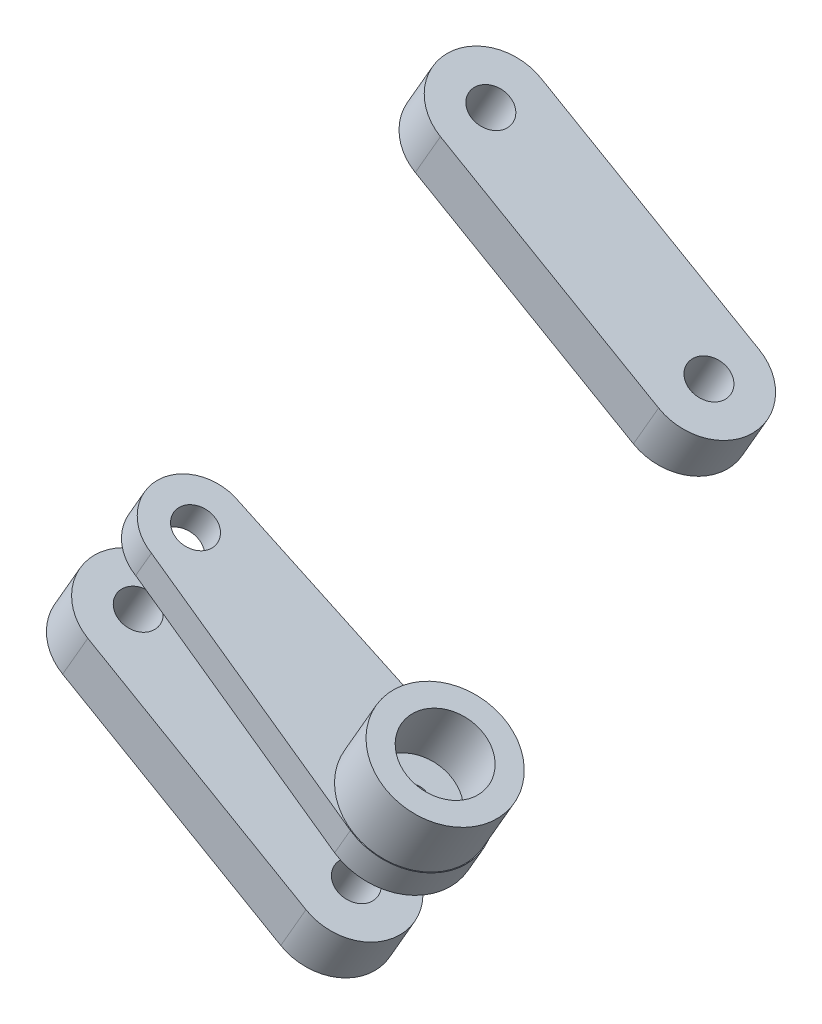
ISO-10303-21;
HEADER;
FILE_DESCRIPTION(('STEP AP214'),'2;1');
FILE_NAME('part.step','',(''),(''),'','','');
FILE_SCHEMA(('AUTOMOTIVE_DESIGN { 1 0 10303 214 1 1 1 1 }'));
ENDSEC;
DATA;
#1=APPLICATION_CONTEXT('core data for automotive mechanical design processes');
#2=APPLICATION_PROTOCOL_DEFINITION('international standard','automotive_design',2000,#1);
#3=PRODUCT_CONTEXT('',#1,'mechanical');
#4=PRODUCT('Part','Part','',(#3));
#5=PRODUCT_RELATED_PRODUCT_CATEGORY('part','',(#4));
#6=PRODUCT_DEFINITION_FORMATION('','',#4);
#7=PRODUCT_DEFINITION_CONTEXT('part definition',#1,'design');
#8=PRODUCT_DEFINITION('design','',#6,#7);
#9=PRODUCT_DEFINITION_SHAPE('','',#8);
#10=(LENGTH_UNIT() NAMED_UNIT(*) SI_UNIT(.MILLI.,.METRE.));
#11=(NAMED_UNIT(*) PLANE_ANGLE_UNIT() SI_UNIT($,.RADIAN.));
#12=(NAMED_UNIT(*) SI_UNIT($,.STERADIAN.) SOLID_ANGLE_UNIT());
#13=UNCERTAINTY_MEASURE_WITH_UNIT(LENGTH_MEASURE(1.E-05),#10,'distance_accuracy_value','');
#14=(GEOMETRIC_REPRESENTATION_CONTEXT(3) GLOBAL_UNCERTAINTY_ASSIGNED_CONTEXT((#13)) GLOBAL_UNIT_ASSIGNED_CONTEXT((#10,
#11,#12)) REPRESENTATION_CONTEXT('',''));
#15=CARTESIAN_POINT('',(0.,0.,0.));
#16=DIRECTION('',(0.,0.,1.));
#17=DIRECTION('',(1.,0.,0.));
#18=AXIS2_PLACEMENT_3D('',#15,#16,#17);
#19=CARTESIAN_POINT('',(638.208275066706,936.295987182416,1324.75360446065));
#20=DIRECTION('',(-0.499999999999999,-0.866025403784439,0.));
#21=DIRECTION('',(-2.54504750607509E-13,1.4642453916025E-13,1.));
#22=AXIS2_PLACEMENT_3D('',#19,#20,#21);
#23=PLANE('',#22);
#24=CARTESIAN_POINT('',(638.208275066706,936.295987182416,1324.75360446065));
#25=DIRECTION('',(-0.499999999999999,-0.866025403784439,0.));
#26=DIRECTION('',(-2.54504750607509E-13,1.4642453916025E-13,1.));
#27=AXIS2_PLACEMENT_3D('',#24,#25,#26);
#28=CIRCLE('',#27,1.5);
#29=CARTESIAN_POINT('',(638.208275066705,936.295987182417,1326.25360446065));
#30=VERTEX_POINT('',#29);
#31=EDGE_CURVE('P0_E84',#30,#30,#28,.T.);
#32=ORIENTED_EDGE('',*,*,#31,.F.);
#33=EDGE_LOOP('',(#32));
#34=FACE_BOUND('',#33,.T.);
#35=CARTESIAN_POINT('',(638.208275066706,936.295987182416,1324.75360446065));
#36=DIRECTION('',(-0.499999999999999,-0.866025403784439,0.));
#37=DIRECTION('',(-2.54504750607509E-13,1.4642453916025E-13,1.));
#38=AXIS2_PLACEMENT_3D('',#35,#36,#37);
#39=CIRCLE('',#38,4.);
#40=CARTESIAN_POINT('',(638.208275066705,936.295987182417,1328.75360446065));
#41=VERTEX_POINT('',#40);
#42=CARTESIAN_POINT('',(638.208275066707,936.295987182416,1320.75360446065));
#43=VERTEX_POINT('',#42);
#44=EDGE_CURVE('P0_E69',#41,#43,#39,.T.);
#45=ORIENTED_EDGE('',*,*,#44,.T.);
#46=DIRECTION('',(0.866025403784439,-0.499999999999999,2.93619848990051E-13));
#47=VECTOR('',#46,1.);
#48=CARTESIAN_POINT('',(638.208275066707,936.295987182416,1320.75360446065));
#49=LINE('',#48,#47);
#50=CARTESIAN_POINT('',(655.528783142396,926.295987182416,1320.75360446066));
#51=VERTEX_POINT('',#50);
#52=EDGE_CURVE('P0_E64',#43,#51,#49,.T.);
#53=ORIENTED_EDGE('',*,*,#52,.T.);
#54=CARTESIAN_POINT('',(655.528783142395,926.295987182416,1324.75360446066));
#55=DIRECTION('',(-0.499999999999999,-0.866025403784439,0.));
#56=DIRECTION('',(-2.54504750607509E-13,1.4642453916025E-13,1.));
#57=AXIS2_PLACEMENT_3D('',#54,#55,#56);
#58=CIRCLE('',#57,4.);
#59=CARTESIAN_POINT('',(655.528783142394,926.295987182417,1328.75360446066));
#60=VERTEX_POINT('',#59);
#61=EDGE_CURVE('P0_E67',#51,#60,#58,.T.);
#62=ORIENTED_EDGE('',*,*,#61,.T.);
#63=DIRECTION('',(-0.866025403784439,0.499999999999999,-2.93619848990051E-13));
#64=VECTOR('',#63,1.);
#65=CARTESIAN_POINT('',(638.208275066705,936.295987182417,1328.75360446065));
#66=LINE('',#65,#64);
#67=EDGE_CURVE('P0_E34',#60,#41,#66,.T.);
#68=ORIENTED_EDGE('',*,*,#67,.T.);
#69=EDGE_LOOP('',(#45,#53,#62,#68));
#70=FACE_BOUND('',#69,.T.);
#71=CARTESIAN_POINT('',(655.528783142395,926.295987182416,1324.75360446066));
#72=DIRECTION('',(-0.499999999999999,-0.866025403784439,0.));
#73=DIRECTION('',(-2.54504750607509E-13,1.4642453916025E-13,1.));
#74=AXIS2_PLACEMENT_3D('',#71,#72,#73);
#75=CIRCLE('',#74,1.5);
#76=CARTESIAN_POINT('',(655.528783142394,926.295987182417,1326.25360446066));
#77=VERTEX_POINT('',#76);
#78=EDGE_CURVE('P0_E99',#77,#77,#75,.T.);
#79=ORIENTED_EDGE('',*,*,#78,.F.);
#80=EDGE_LOOP('',(#79));
#81=FACE_BOUND('',#80,.T.);
#82=ADVANCED_FACE('P0_F17',(#34,#70,#81),#23,.T.);
#83=CARTESIAN_POINT('',(640.208275066706,939.760088797554,1324.75360446065));
#84=DIRECTION('',(-0.499999999999999,-0.866025403784439,0.));
#85=DIRECTION('',(-2.54504750607509E-13,1.4642453916025E-13,1.));
#86=AXIS2_PLACEMENT_3D('',#83,#84,#85);
#87=PLANE('',#86);
#88=CARTESIAN_POINT('',(640.208275066706,939.760088797554,1324.75360446065));
#89=DIRECTION('',(-0.499999999999999,-0.866025403784439,0.));
#90=DIRECTION('',(-2.54504750607509E-13,1.4642453916025E-13,1.));
#91=AXIS2_PLACEMENT_3D('',#88,#89,#90);
#92=CIRCLE('',#91,4.);
#93=CARTESIAN_POINT('',(640.208275066705,939.760088797555,1328.75360446065));
#94=VERTEX_POINT('',#93);
#95=CARTESIAN_POINT('',(640.208275066707,939.760088797554,1320.75360446065));
#96=VERTEX_POINT('',#95);
#97=EDGE_CURVE('P0_E81',#94,#96,#92,.T.);
#98=ORIENTED_EDGE('',*,*,#97,.F.);
#99=DIRECTION('',(-0.866025403784439,0.499999999999999,-2.93619848990051E-13));
#100=VECTOR('',#99,1.);
#101=CARTESIAN_POINT('',(640.208275066705,939.760088797555,1328.75360446065));
#102=LINE('',#101,#100);
#103=CARTESIAN_POINT('',(657.528783142394,929.760088797555,1328.75360446066));
#104=VERTEX_POINT('',#103);
#105=EDGE_CURVE('P0_E57',#104,#94,#102,.T.);
#106=ORIENTED_EDGE('',*,*,#105,.F.);
#107=CARTESIAN_POINT('',(657.528783142395,929.760088797554,1324.75360446066));
#108=DIRECTION('',(-0.499999999999999,-0.866025403784439,0.));
#109=DIRECTION('',(-2.54504750607509E-13,1.4642453916025E-13,1.));
#110=AXIS2_PLACEMENT_3D('',#107,#108,#109);
#111=CIRCLE('',#110,4.);
#112=CARTESIAN_POINT('',(657.528783142396,929.760088797554,1320.75360446066));
#113=VERTEX_POINT('',#112);
#114=EDGE_CURVE('P0_E51',#113,#104,#111,.T.);
#115=ORIENTED_EDGE('',*,*,#114,.F.);
#116=DIRECTION('',(0.866025403784439,-0.499999999999999,2.93619848990051E-13));
#117=VECTOR('',#116,1.);
#118=CARTESIAN_POINT('',(640.208275066707,939.760088797554,1320.75360446065));
#119=LINE('',#118,#117);
#120=EDGE_CURVE('P0_E73',#96,#113,#119,.T.);
#121=ORIENTED_EDGE('',*,*,#120,.F.);
#122=EDGE_LOOP('',(#98,#106,#115,#121));
#123=FACE_BOUND('',#122,.T.);
#124=CARTESIAN_POINT('',(640.208275066706,939.760088797554,1324.75360446065));
#125=DIRECTION('',(-0.499999999999999,-0.866025403784439,0.));
#126=DIRECTION('',(-2.54504750607509E-13,1.4642453916025E-13,1.));
#127=AXIS2_PLACEMENT_3D('',#124,#125,#126);
#128=CIRCLE('',#127,1.5);
#129=CARTESIAN_POINT('',(640.208275066705,939.760088797554,1326.25360446065));
#130=VERTEX_POINT('',#129);
#131=EDGE_CURVE('P0_E96',#130,#130,#128,.T.);
#132=ORIENTED_EDGE('',*,*,#131,.T.);
#133=EDGE_LOOP('',(#132));
#134=FACE_BOUND('',#133,.T.);
#135=CARTESIAN_POINT('',(657.528783142395,929.760088797554,1324.75360446066));
#136=DIRECTION('',(-0.499999999999999,-0.866025403784439,0.));
#137=DIRECTION('',(-2.54504750607509E-13,1.4642453916025E-13,1.));
#138=AXIS2_PLACEMENT_3D('',#135,#136,#137);
#139=CIRCLE('',#138,1.5);
#140=CARTESIAN_POINT('',(657.528783142394,929.760088797554,1326.25360446066));
#141=VERTEX_POINT('',#140);
#142=EDGE_CURVE('P0_E102',#141,#141,#139,.T.);
#143=ORIENTED_EDGE('',*,*,#142,.T.);
#144=EDGE_LOOP('',(#143));
#145=FACE_BOUND('',#144,.T.);
#146=ADVANCED_FACE('P0_F92',(#123,#134,#145),#87,.F.);
#147=CARTESIAN_POINT('',(638.208275066706,936.295987182416,1324.75360446065));
#148=DIRECTION('',(0.499999999999999,0.866025403784439,0.));
#149=DIRECTION('',(2.54504750607509E-13,-1.4642453916025E-13,-1.));
#150=AXIS2_PLACEMENT_3D('',#147,#148,#149);
#151=CYLINDRICAL_SURFACE('',#150,4.);
#152=ORIENTED_EDGE('',*,*,#97,.T.);
#153=DIRECTION('',(0.499999999999999,0.866025403784439,0.));
#154=VECTOR('',#153,1.);
#155=CARTESIAN_POINT('',(638.208275066707,936.295987182416,1320.75360446065));
#156=LINE('',#155,#154);
#157=EDGE_CURVE('P0_E11',#43,#96,#156,.T.);
#158=ORIENTED_EDGE('',*,*,#157,.F.);
#159=ORIENTED_EDGE('',*,*,#44,.F.);
#160=DIRECTION('',(0.499999999999999,0.866025403784439,0.));
#161=VECTOR('',#160,1.);
#162=CARTESIAN_POINT('',(638.208275066705,936.295987182417,1328.75360446065));
#163=LINE('',#162,#161);
#164=EDGE_CURVE('P0_E77',#41,#94,#163,.T.);
#165=ORIENTED_EDGE('',*,*,#164,.T.);
#166=EDGE_LOOP('',(#152,#158,#159,#165));
#167=FACE_BOUND('',#166,.T.);
#168=ADVANCED_FACE('P0_F19',(#167),#151,.T.);
#169=CARTESIAN_POINT('',(638.208275066707,936.295987182416,1320.75360446065));
#170=DIRECTION('',(-2.54504750607509E-13,1.4642453916025E-13,1.));
#171=DIRECTION('',(0.499999999999999,0.866025403784439,0.));
#172=AXIS2_PLACEMENT_3D('',#169,#170,#171);
#173=PLANE('',#172);
#174=ORIENTED_EDGE('',*,*,#120,.T.);
#175=DIRECTION('',(0.499999999999999,0.866025403784439,0.));
#176=VECTOR('',#175,1.);
#177=CARTESIAN_POINT('',(655.528783142396,926.295987182416,1320.75360446066));
#178=LINE('',#177,#176);
#179=EDGE_CURVE('P0_E26',#51,#113,#178,.T.);
#180=ORIENTED_EDGE('',*,*,#179,.F.);
#181=ORIENTED_EDGE('',*,*,#52,.F.);
#182=ORIENTED_EDGE('',*,*,#157,.T.);
#183=EDGE_LOOP('',(#174,#180,#181,#182));
#184=FACE_BOUND('',#183,.T.);
#185=ADVANCED_FACE('P0_F72',(#184),#173,.F.);
#186=CARTESIAN_POINT('',(655.528783142395,926.295987182416,1324.75360446066));
#187=DIRECTION('',(0.499999999999999,0.866025403784439,0.));
#188=DIRECTION('',(2.54504750607509E-13,-1.4642453916025E-13,-1.));
#189=AXIS2_PLACEMENT_3D('',#186,#187,#188);
#190=CYLINDRICAL_SURFACE('',#189,4.);
#191=ORIENTED_EDGE('',*,*,#114,.T.);
#192=DIRECTION('',(0.499999999999999,0.866025403784439,0.));
#193=VECTOR('',#192,1.);
#194=CARTESIAN_POINT('',(655.528783142394,926.295987182417,1328.75360446066));
#195=LINE('',#194,#193);
#196=EDGE_CURVE('P0_E74',#60,#104,#195,.T.);
#197=ORIENTED_EDGE('',*,*,#196,.F.);
#198=ORIENTED_EDGE('',*,*,#61,.F.);
#199=ORIENTED_EDGE('',*,*,#179,.T.);
#200=EDGE_LOOP('',(#191,#197,#198,#199));
#201=FACE_BOUND('',#200,.T.);
#202=ADVANCED_FACE('P0_F75',(#201),#190,.T.);
#203=CARTESIAN_POINT('',(638.208275066705,936.295987182417,1328.75360446065));
#204=DIRECTION('',(2.54504750607509E-13,-1.4642453916025E-13,-1.));
#205=DIRECTION('',(-0.499999999999999,-0.866025403784439,0.));
#206=AXIS2_PLACEMENT_3D('',#203,#204,#205);
#207=PLANE('',#206);
#208=ORIENTED_EDGE('',*,*,#105,.T.);
#209=ORIENTED_EDGE('',*,*,#164,.F.);
#210=ORIENTED_EDGE('',*,*,#67,.F.);
#211=ORIENTED_EDGE('',*,*,#196,.T.);
#212=EDGE_LOOP('',(#208,#209,#210,#211));
#213=FACE_BOUND('',#212,.T.);
#214=ADVANCED_FACE('P0_F89',(#213),#207,.F.);
#215=CARTESIAN_POINT('',(638.208275066706,936.295987182416,1324.75360446065));
#216=DIRECTION('',(0.499999999999999,0.866025403784439,0.));
#217=DIRECTION('',(2.54504750607509E-13,-1.4642453916025E-13,-1.));
#218=AXIS2_PLACEMENT_3D('',#215,#216,#217);
#219=CYLINDRICAL_SURFACE('',#218,1.5);
#220=ORIENTED_EDGE('',*,*,#31,.T.);
#221=EDGE_LOOP('',(#220));
#222=FACE_BOUND('',#221,.T.);
#223=ORIENTED_EDGE('',*,*,#131,.F.);
#224=EDGE_LOOP('',(#223));
#225=FACE_BOUND('',#224,.T.);
#226=ADVANCED_FACE('P0_F120',(#222,#225),#219,.F.);
#227=CARTESIAN_POINT('',(655.528783142395,926.295987182416,1324.75360446066));
#228=DIRECTION('',(0.499999999999999,0.866025403784439,0.));
#229=DIRECTION('',(2.54504750607509E-13,-1.4642453916025E-13,-1.));
#230=AXIS2_PLACEMENT_3D('',#227,#228,#229);
#231=CYLINDRICAL_SURFACE('',#230,1.5);
#232=ORIENTED_EDGE('',*,*,#78,.T.);
#233=EDGE_LOOP('',(#232));
#234=FACE_BOUND('',#233,.T.);
#235=ORIENTED_EDGE('',*,*,#142,.F.);
#236=EDGE_LOOP('',(#235));
#237=FACE_BOUND('',#236,.T.);
#238=ADVANCED_FACE('P0_F108',(#234,#237),#231,.F.);
#239=CLOSED_SHELL('',(#82,#146,#168,#185,#202,#214,#226,#238));
#240=MANIFOLD_SOLID_BREP('P0_B1',#239);
#241=CARTESIAN_POINT('',(610.208275067009,887.798564570313,1324.75360446062));
#242=DIRECTION('',(-0.5,-0.866025403784438,0.));
#243=DIRECTION('',(0.,0.,1.));
#244=AXIS2_PLACEMENT_3D('',#241,#242,#243);
#245=PLANE('',#244);
#246=CARTESIAN_POINT('',(610.208275067009,887.798564570313,1324.75360446062));
#247=DIRECTION('',(-0.5,-0.866025403784438,0.));
#248=DIRECTION('',(0.,0.,1.));
#249=AXIS2_PLACEMENT_3D('',#246,#247,#248);
#250=CIRCLE('',#249,1.5);
#251=CARTESIAN_POINT('',(610.208275067009,887.798564570313,1323.25360446062));
#252=VERTEX_POINT('',#251);
#253=EDGE_CURVE('P1_E84',#252,#252,#250,.T.);
#254=ORIENTED_EDGE('',*,*,#253,.F.);
#255=EDGE_LOOP('',(#254));
#256=FACE_BOUND('',#255,.T.);
#257=CARTESIAN_POINT('',(610.208275067009,887.798564570313,1324.75360446062));
#258=DIRECTION('',(-0.5,-0.866025403784438,0.));
#259=DIRECTION('',(0.,0.,1.));
#260=AXIS2_PLACEMENT_3D('',#257,#258,#259);
#261=CIRCLE('',#260,4.);
#262=CARTESIAN_POINT('',(610.208275067009,887.798564570313,1328.75360446062));
#263=VERTEX_POINT('',#262);
#264=CARTESIAN_POINT('',(610.208275067009,887.798564570313,1320.75360446062));
#265=VERTEX_POINT('',#264);
#266=EDGE_CURVE('P1_E69',#263,#265,#261,.T.);
#267=ORIENTED_EDGE('',*,*,#266,.T.);
#268=DIRECTION('',(0.866025403784438,-0.500000000000001,0.));
#269=VECTOR('',#268,1.);
#270=CARTESIAN_POINT('',(610.208275067009,887.798564570313,1320.75360446062));
#271=LINE('',#270,#269);
#272=CARTESIAN_POINT('',(627.528783142698,877.798564570313,1320.75360446062));
#273=VERTEX_POINT('',#272);
#274=EDGE_CURVE('P1_E64',#265,#273,#271,.T.);
#275=ORIENTED_EDGE('',*,*,#274,.T.);
#276=CARTESIAN_POINT('',(627.528783142698,877.798564570313,1324.75360446062));
#277=DIRECTION('',(-0.5,-0.866025403784438,0.));
#278=DIRECTION('',(0.,0.,1.));
#279=AXIS2_PLACEMENT_3D('',#276,#277,#278);
#280=CIRCLE('',#279,4.);
#281=CARTESIAN_POINT('',(627.528783142698,877.798564570313,1328.75360446062));
#282=VERTEX_POINT('',#281);
#283=EDGE_CURVE('P1_E67',#273,#282,#280,.T.);
#284=ORIENTED_EDGE('',*,*,#283,.T.);
#285=DIRECTION('',(-0.866025403784438,0.500000000000001,0.));
#286=VECTOR('',#285,1.);
#287=CARTESIAN_POINT('',(610.208275067009,887.798564570313,1328.75360446062));
#288=LINE('',#287,#286);
#289=EDGE_CURVE('P1_E34',#282,#263,#288,.T.);
#290=ORIENTED_EDGE('',*,*,#289,.T.);
#291=EDGE_LOOP('',(#267,#275,#284,#290));
#292=FACE_BOUND('',#291,.T.);
#293=CARTESIAN_POINT('',(627.528783142698,877.798564570313,1324.75360446062));
#294=DIRECTION('',(-0.5,-0.866025403784438,0.));
#295=DIRECTION('',(0.,0.,1.));
#296=AXIS2_PLACEMENT_3D('',#293,#294,#295);
#297=CIRCLE('',#296,1.5);
#298=CARTESIAN_POINT('',(627.528783142698,877.798564570313,1323.25360446062));
#299=VERTEX_POINT('',#298);
#300=EDGE_CURVE('P1_E99',#299,#299,#297,.T.);
#301=ORIENTED_EDGE('',*,*,#300,.F.);
#302=EDGE_LOOP('',(#301));
#303=FACE_BOUND('',#302,.T.);
#304=ADVANCED_FACE('P1_F17',(#256,#292,#303),#245,.T.);
#305=CARTESIAN_POINT('',(612.208275067009,891.26266618545,1324.75360446062));
#306=DIRECTION('',(-0.5,-0.866025403784438,0.));
#307=DIRECTION('',(0.,0.,1.));
#308=AXIS2_PLACEMENT_3D('',#305,#306,#307);
#309=PLANE('',#308);
#310=CARTESIAN_POINT('',(612.208275067009,891.26266618545,1324.75360446062));
#311=DIRECTION('',(-0.5,-0.866025403784438,0.));
#312=DIRECTION('',(0.,0.,1.));
#313=AXIS2_PLACEMENT_3D('',#310,#311,#312);
#314=CIRCLE('',#313,4.);
#315=CARTESIAN_POINT('',(612.208275067009,891.26266618545,1328.75360446062));
#316=VERTEX_POINT('',#315);
#317=CARTESIAN_POINT('',(612.208275067009,891.26266618545,1320.75360446062));
#318=VERTEX_POINT('',#317);
#319=EDGE_CURVE('P1_E81',#316,#318,#314,.T.);
#320=ORIENTED_EDGE('',*,*,#319,.F.);
#321=DIRECTION('',(-0.866025403784438,0.500000000000001,0.));
#322=VECTOR('',#321,1.);
#323=CARTESIAN_POINT('',(612.208275067009,891.26266618545,1328.75360446062));
#324=LINE('',#323,#322);
#325=CARTESIAN_POINT('',(629.528783142698,881.26266618545,1328.75360446062));
#326=VERTEX_POINT('',#325);
#327=EDGE_CURVE('P1_E57',#326,#316,#324,.T.);
#328=ORIENTED_EDGE('',*,*,#327,.F.);
#329=CARTESIAN_POINT('',(629.528783142698,881.26266618545,1324.75360446062));
#330=DIRECTION('',(-0.5,-0.866025403784438,0.));
#331=DIRECTION('',(0.,0.,1.));
#332=AXIS2_PLACEMENT_3D('',#329,#330,#331);
#333=CIRCLE('',#332,4.);
#334=CARTESIAN_POINT('',(629.528783142698,881.26266618545,1320.75360446062));
#335=VERTEX_POINT('',#334);
#336=EDGE_CURVE('P1_E51',#335,#326,#333,.T.);
#337=ORIENTED_EDGE('',*,*,#336,.F.);
#338=DIRECTION('',(0.866025403784438,-0.500000000000001,0.));
#339=VECTOR('',#338,1.);
#340=CARTESIAN_POINT('',(612.208275067009,891.26266618545,1320.75360446062));
#341=LINE('',#340,#339);
#342=EDGE_CURVE('P1_E73',#318,#335,#341,.T.);
#343=ORIENTED_EDGE('',*,*,#342,.F.);
#344=EDGE_LOOP('',(#320,#328,#337,#343));
#345=FACE_BOUND('',#344,.T.);
#346=CARTESIAN_POINT('',(612.208275067009,891.26266618545,1324.75360446062));
#347=DIRECTION('',(-0.5,-0.866025403784438,0.));
#348=DIRECTION('',(0.,0.,1.));
#349=AXIS2_PLACEMENT_3D('',#346,#347,#348);
#350=CIRCLE('',#349,1.5);
#351=CARTESIAN_POINT('',(612.208275067009,891.26266618545,1323.25360446062));
#352=VERTEX_POINT('',#351);
#353=EDGE_CURVE('P1_E96',#352,#352,#350,.T.);
#354=ORIENTED_EDGE('',*,*,#353,.T.);
#355=EDGE_LOOP('',(#354));
#356=FACE_BOUND('',#355,.T.);
#357=CARTESIAN_POINT('',(629.528783142698,881.26266618545,1324.75360446062));
#358=DIRECTION('',(-0.5,-0.866025403784438,0.));
#359=DIRECTION('',(0.,0.,1.));
#360=AXIS2_PLACEMENT_3D('',#357,#358,#359);
#361=CIRCLE('',#360,1.5);
#362=CARTESIAN_POINT('',(629.528783142698,881.26266618545,1323.25360446062));
#363=VERTEX_POINT('',#362);
#364=EDGE_CURVE('P1_E102',#363,#363,#361,.T.);
#365=ORIENTED_EDGE('',*,*,#364,.T.);
#366=EDGE_LOOP('',(#365));
#367=FACE_BOUND('',#366,.T.);
#368=ADVANCED_FACE('P1_F92',(#345,#356,#367),#309,.F.);
#369=CARTESIAN_POINT('',(610.208275067009,887.798564570313,1324.75360446062));
#370=DIRECTION('',(0.5,0.866025403784438,0.));
#371=DIRECTION('',(0.,0.,-1.));
#372=AXIS2_PLACEMENT_3D('',#369,#370,#371);
#373=CYLINDRICAL_SURFACE('',#372,4.);
#374=ORIENTED_EDGE('',*,*,#319,.T.);
#375=DIRECTION('',(0.5,0.866025403784438,0.));
#376=VECTOR('',#375,1.);
#377=CARTESIAN_POINT('',(610.208275067009,887.798564570313,1320.75360446062));
#378=LINE('',#377,#376);
#379=EDGE_CURVE('P1_E11',#265,#318,#378,.T.);
#380=ORIENTED_EDGE('',*,*,#379,.F.);
#381=ORIENTED_EDGE('',*,*,#266,.F.);
#382=DIRECTION('',(0.5,0.866025403784438,0.));
#383=VECTOR('',#382,1.);
#384=CARTESIAN_POINT('',(610.208275067009,887.798564570313,1328.75360446062));
#385=LINE('',#384,#383);
#386=EDGE_CURVE('P1_E77',#263,#316,#385,.T.);
#387=ORIENTED_EDGE('',*,*,#386,.T.);
#388=EDGE_LOOP('',(#374,#380,#381,#387));
#389=FACE_BOUND('',#388,.T.);
#390=ADVANCED_FACE('P1_F19',(#389),#373,.T.);
#391=CARTESIAN_POINT('',(610.208275067009,887.798564570313,1320.75360446062));
#392=DIRECTION('',(0.,0.,1.));
#393=DIRECTION('',(0.5,0.866025403784438,0.));
#394=AXIS2_PLACEMENT_3D('',#391,#392,#393);
#395=PLANE('',#394);
#396=ORIENTED_EDGE('',*,*,#342,.T.);
#397=DIRECTION('',(0.5,0.866025403784438,0.));
#398=VECTOR('',#397,1.);
#399=CARTESIAN_POINT('',(627.528783142698,877.798564570313,1320.75360446062));
#400=LINE('',#399,#398);
#401=EDGE_CURVE('P1_E26',#273,#335,#400,.T.);
#402=ORIENTED_EDGE('',*,*,#401,.F.);
#403=ORIENTED_EDGE('',*,*,#274,.F.);
#404=ORIENTED_EDGE('',*,*,#379,.T.);
#405=EDGE_LOOP('',(#396,#402,#403,#404));
#406=FACE_BOUND('',#405,.T.);
#407=ADVANCED_FACE('P1_F72',(#406),#395,.F.);
#408=CARTESIAN_POINT('',(627.528783142698,877.798564570313,1324.75360446062));
#409=DIRECTION('',(0.5,0.866025403784438,0.));
#410=DIRECTION('',(0.,0.,-1.));
#411=AXIS2_PLACEMENT_3D('',#408,#409,#410);
#412=CYLINDRICAL_SURFACE('',#411,4.);
#413=ORIENTED_EDGE('',*,*,#336,.T.);
#414=DIRECTION('',(0.5,0.866025403784438,0.));
#415=VECTOR('',#414,1.);
#416=CARTESIAN_POINT('',(627.528783142698,877.798564570313,1328.75360446062));
#417=LINE('',#416,#415);
#418=EDGE_CURVE('P1_E74',#282,#326,#417,.T.);
#419=ORIENTED_EDGE('',*,*,#418,.F.);
#420=ORIENTED_EDGE('',*,*,#283,.F.);
#421=ORIENTED_EDGE('',*,*,#401,.T.);
#422=EDGE_LOOP('',(#413,#419,#420,#421));
#423=FACE_BOUND('',#422,.T.);
#424=ADVANCED_FACE('P1_F75',(#423),#412,.T.);
#425=CARTESIAN_POINT('',(610.208275067009,887.798564570313,1328.75360446062));
#426=DIRECTION('',(0.,0.,-1.));
#427=DIRECTION('',(-0.5,-0.866025403784438,0.));
#428=AXIS2_PLACEMENT_3D('',#425,#426,#427);
#429=PLANE('',#428);
#430=ORIENTED_EDGE('',*,*,#327,.T.);
#431=ORIENTED_EDGE('',*,*,#386,.F.);
#432=ORIENTED_EDGE('',*,*,#289,.F.);
#433=ORIENTED_EDGE('',*,*,#418,.T.);
#434=EDGE_LOOP('',(#430,#431,#432,#433));
#435=FACE_BOUND('',#434,.T.);
#436=ADVANCED_FACE('P1_F89',(#435),#429,.F.);
#437=CARTESIAN_POINT('',(610.208275067009,887.798564570313,1324.75360446062));
#438=DIRECTION('',(0.5,0.866025403784438,0.));
#439=DIRECTION('',(0.,0.,-1.));
#440=AXIS2_PLACEMENT_3D('',#437,#438,#439);
#441=CYLINDRICAL_SURFACE('',#440,1.5);
#442=CARTESIAN_POINT('',(610.208275067009,887.798564570313,1323.25360446062));
#443=CARTESIAN_POINT('',(610.229108400342,887.834648962137,1323.25360446062));
#444=CARTESIAN_POINT('',(610.249941733676,887.870733353961,1323.25360446062));
#445=CARTESIAN_POINT('',(610.291608400342,887.94290213761,1323.25360446062));
#446=CARTESIAN_POINT('',(610.312441733676,887.978986529434,1323.25360446062));
#447=CARTESIAN_POINT('',(610.354108400342,888.051155313083,1323.25360446062));
#448=CARTESIAN_POINT('',(610.374941733676,888.087239704907,1323.25360446062));
#449=CARTESIAN_POINT('',(610.416608400342,888.159408488556,1323.25360446062));
#450=CARTESIAN_POINT('',(610.437441733676,888.19549288038,1323.25360446062));
#451=CARTESIAN_POINT('',(610.479108400342,888.267661664029,1323.25360446062));
#452=CARTESIAN_POINT('',(610.499941733676,888.303746055854,1323.25360446062));
#453=CARTESIAN_POINT('',(610.541608400342,888.375914839502,1323.25360446062));
#454=CARTESIAN_POINT('',(610.562441733676,888.411999231327,1323.25360446062));
#455=CARTESIAN_POINT('',(610.604108400342,888.484168014975,1323.25360446062));
#456=CARTESIAN_POINT('',(610.624941733676,888.5202524068,1323.25360446062));
#457=CARTESIAN_POINT('',(610.666608400342,888.592421190448,1323.25360446062));
#458=CARTESIAN_POINT('',(610.687441733676,888.628505582273,1323.25360446062));
#459=CARTESIAN_POINT('',(610.729108400342,888.700674365921,1323.25360446062));
#460=CARTESIAN_POINT('',(610.749941733676,888.736758757746,1323.25360446062));
#461=CARTESIAN_POINT('',(610.791608400342,888.808927541394,1323.25360446062));
#462=CARTESIAN_POINT('',(610.812441733676,888.845011933219,1323.25360446062));
#463=CARTESIAN_POINT('',(610.854108400342,888.917180716868,1323.25360446062));
#464=CARTESIAN_POINT('',(610.874941733676,888.953265108692,1323.25360446062));
#465=CARTESIAN_POINT('',(610.916608400342,889.025433892341,1323.25360446062));
#466=CARTESIAN_POINT('',(610.937441733676,889.061518284165,1323.25360446062));
#467=CARTESIAN_POINT('',(610.979108400342,889.133687067814,1323.25360446062));
#468=CARTESIAN_POINT('',(610.999941733676,889.169771459638,1323.25360446062));
#469=CARTESIAN_POINT('',(611.041608400342,889.241940243287,1323.25360446062));
#470=CARTESIAN_POINT('',(611.062441733676,889.278024635111,1323.25360446062));
#471=CARTESIAN_POINT('',(611.104108400342,889.35019341876,1323.25360446062));
#472=CARTESIAN_POINT('',(611.124941733676,889.386277810584,1323.25360446062));
#473=CARTESIAN_POINT('',(611.166608400342,889.458446594233,1323.25360446062));
#474=CARTESIAN_POINT('',(611.187441733676,889.494530986057,1323.25360446062));
#475=CARTESIAN_POINT('',(611.229108400342,889.566699769706,1323.25360446062));
#476=CARTESIAN_POINT('',(611.249941733676,889.60278416153,1323.25360446062));
#477=CARTESIAN_POINT('',(611.291608400342,889.674952945179,1323.25360446062));
#478=CARTESIAN_POINT('',(611.312441733676,889.711037337003,1323.25360446062));
#479=CARTESIAN_POINT('',(611.354108400342,889.783206120652,1323.25360446062));
#480=CARTESIAN_POINT('',(611.374941733676,889.819290512476,1323.25360446062));
#481=CARTESIAN_POINT('',(611.416608400342,889.891459296125,1323.25360446062));
#482=CARTESIAN_POINT('',(611.437441733676,889.927543687949,1323.25360446062));
#483=CARTESIAN_POINT('',(611.479108400342,889.999712471598,1323.25360446062));
#484=CARTESIAN_POINT('',(611.499941733676,890.035796863423,1323.25360446062));
#485=CARTESIAN_POINT('',(611.541608400342,890.107965647071,1323.25360446062));
#486=CARTESIAN_POINT('',(611.562441733676,890.144050038896,1323.25360446062));
#487=CARTESIAN_POINT('',(611.604108400342,890.216218822544,1323.25360446062));
#488=CARTESIAN_POINT('',(611.624941733676,890.252303214369,1323.25360446062));
#489=CARTESIAN_POINT('',(611.666608400342,890.324471998017,1323.25360446062));
#490=CARTESIAN_POINT('',(611.687441733676,890.360556389842,1323.25360446062));
#491=CARTESIAN_POINT('',(611.729108400342,890.43272517349,1323.25360446062));
#492=CARTESIAN_POINT('',(611.749941733676,890.468809565315,1323.25360446062));
#493=CARTESIAN_POINT('',(611.791608400342,890.540978348963,1323.25360446062));
#494=CARTESIAN_POINT('',(611.812441733676,890.577062740788,1323.25360446062));
#495=CARTESIAN_POINT('',(611.854108400342,890.649231524436,1323.25360446062));
#496=CARTESIAN_POINT('',(611.874941733676,890.685315916261,1323.25360446062));
#497=CARTESIAN_POINT('',(611.916608400342,890.757484699909,1323.25360446062));
#498=CARTESIAN_POINT('',(611.937441733676,890.793569091734,1323.25360446062));
#499=CARTESIAN_POINT('',(611.979108400342,890.865737875382,1323.25360446062));
#500=CARTESIAN_POINT('',(611.999941733676,890.901822267207,1323.25360446062));
#501=CARTESIAN_POINT('',(612.041608400342,890.973991050856,1323.25360446062));
#502=CARTESIAN_POINT('',(612.062441733676,891.01007544268,1323.25360446062));
#503=CARTESIAN_POINT('',(612.104108400342,891.082244226329,1323.25360446062));
#504=CARTESIAN_POINT('',(612.124941733676,891.118328618153,1323.25360446062));
#505=CARTESIAN_POINT('',(612.166608400342,891.190497401802,1323.25360446062));
#506=CARTESIAN_POINT('',(612.187441733676,891.226581793626,1323.25360446062));
#507=CARTESIAN_POINT('',(612.208275067009,891.26266618545,1323.25360446062));
#508=B_SPLINE_CURVE_WITH_KNOTS('',3,(#442,#443,#444,#445,#446,#447,#448,#449,#450,#451,#452,
#453,#454,#455,#456,#457,#458,#459,#460,#461,#462,#463,#464,#465,#466,#467,#468,#469,#470,#471,
#472,#473,#474,#475,#476,#477,#478,#479,#480,#481,#482,#483,#484,#485,#486,#487,#488,#489,#490,
#491,#492,#493,#494,#495,#496,#497,#498,#499,#500,#501,#502,#503,#504,#505,#506,#507),
.UNSPECIFIED.,.F.,.F.,(4,2,2,2,2,2,2,2,2,2,2,2,2,2,2,2,2,2,2,2,2,2,2,2,2,2,2,2,2,2,2,2,4),(0.,
0.125000000000111,0.25000000000007,0.375000000000029,0.500000000000044,0.625000000000099,
0.750000000000058,0.875000000000017,1.00000000000003,1.12500000000009,1.25000000000005,
1.37500000000006,1.50000000000002,1.62500000000008,1.75000000000009,1.87500000000005,
2.00000000000001,2.12500000000012,2.25000000000008,2.37500000000004,2.50000000000005,
2.62500000000011,2.75000000000006,2.87500000000008,3.00000000000004,3.12500000000009,
3.25000000000005,3.37500000000007,3.50000000000003,3.62500000000008,3.7500000000001,
3.87500000000005,4.00000000000001),.UNSPECIFIED.);
#509=EDGE_CURVE('P1_BSEAM120',#252,#352,#508,.T.);
#510=ORIENTED_EDGE('',*,*,#253,.T.);
#511=ORIENTED_EDGE('',*,*,#353,.F.);
#512=ORIENTED_EDGE('',*,*,#509,.T.);
#513=ORIENTED_EDGE('',*,*,#509,.F.);
#514=EDGE_LOOP('',(#510,#512,#511,#513));
#515=FACE_BOUND('',#514,.T.);
#516=ADVANCED_FACE('P1_F120',(#515),#441,.F.);
#517=CARTESIAN_POINT('',(627.528783142698,877.798564570313,1324.75360446062));
#518=DIRECTION('',(0.5,0.866025403784438,0.));
#519=DIRECTION('',(0.,0.,-1.));
#520=AXIS2_PLACEMENT_3D('',#517,#518,#519);
#521=CYLINDRICAL_SURFACE('',#520,1.5);
#522=CARTESIAN_POINT('',(627.528783142698,877.798564570313,1323.25360446062));
#523=CARTESIAN_POINT('',(627.549616476031,877.834648962137,1323.25360446062));
#524=CARTESIAN_POINT('',(627.570449809364,877.870733353961,1323.25360446062));
#525=CARTESIAN_POINT('',(627.612116476031,877.94290213761,1323.25360446062));
#526=CARTESIAN_POINT('',(627.632949809364,877.978986529434,1323.25360446062));
#527=CARTESIAN_POINT('',(627.674616476031,878.051155313083,1323.25360446062));
#528=CARTESIAN_POINT('',(627.695449809364,878.087239704907,1323.25360446062));
#529=CARTESIAN_POINT('',(627.737116476031,878.159408488556,1323.25360446062));
#530=CARTESIAN_POINT('',(627.757949809364,878.19549288038,1323.25360446062));
#531=CARTESIAN_POINT('',(627.799616476031,878.267661664029,1323.25360446062));
#532=CARTESIAN_POINT('',(627.820449809364,878.303746055854,1323.25360446062));
#533=CARTESIAN_POINT('',(627.862116476031,878.375914839502,1323.25360446062));
#534=CARTESIAN_POINT('',(627.882949809364,878.411999231327,1323.25360446062));
#535=CARTESIAN_POINT('',(627.924616476031,878.484168014975,1323.25360446062));
#536=CARTESIAN_POINT('',(627.945449809364,878.5202524068,1323.25360446062));
#537=CARTESIAN_POINT('',(627.987116476031,878.592421190448,1323.25360446062));
#538=CARTESIAN_POINT('',(628.007949809364,878.628505582273,1323.25360446062));
#539=CARTESIAN_POINT('',(628.049616476031,878.700674365921,1323.25360446062));
#540=CARTESIAN_POINT('',(628.070449809364,878.736758757746,1323.25360446062));
#541=CARTESIAN_POINT('',(628.112116476031,878.808927541394,1323.25360446062));
#542=CARTESIAN_POINT('',(628.132949809364,878.845011933219,1323.25360446062));
#543=CARTESIAN_POINT('',(628.174616476031,878.917180716868,1323.25360446062));
#544=CARTESIAN_POINT('',(628.195449809364,878.953265108692,1323.25360446062));
#545=CARTESIAN_POINT('',(628.237116476031,879.025433892341,1323.25360446062));
#546=CARTESIAN_POINT('',(628.257949809364,879.061518284165,1323.25360446062));
#547=CARTESIAN_POINT('',(628.299616476031,879.133687067814,1323.25360446062));
#548=CARTESIAN_POINT('',(628.320449809364,879.169771459638,1323.25360446062));
#549=CARTESIAN_POINT('',(628.362116476031,879.241940243287,1323.25360446062));
#550=CARTESIAN_POINT('',(628.382949809364,879.278024635111,1323.25360446062));
#551=CARTESIAN_POINT('',(628.424616476031,879.35019341876,1323.25360446062));
#552=CARTESIAN_POINT('',(628.445449809364,879.386277810584,1323.25360446062));
#553=CARTESIAN_POINT('',(628.487116476031,879.458446594233,1323.25360446062));
#554=CARTESIAN_POINT('',(628.507949809364,879.494530986057,1323.25360446062));
#555=CARTESIAN_POINT('',(628.549616476031,879.566699769706,1323.25360446062));
#556=CARTESIAN_POINT('',(628.570449809364,879.60278416153,1323.25360446062));
#557=CARTESIAN_POINT('',(628.612116476031,879.674952945179,1323.25360446062));
#558=CARTESIAN_POINT('',(628.632949809364,879.711037337003,1323.25360446062));
#559=CARTESIAN_POINT('',(628.674616476031,879.783206120652,1323.25360446062));
#560=CARTESIAN_POINT('',(628.695449809364,879.819290512476,1323.25360446062));
#561=CARTESIAN_POINT('',(628.737116476031,879.891459296125,1323.25360446062));
#562=CARTESIAN_POINT('',(628.757949809364,879.927543687949,1323.25360446062));
#563=CARTESIAN_POINT('',(628.799616476031,879.999712471598,1323.25360446062));
#564=CARTESIAN_POINT('',(628.820449809364,880.035796863422,1323.25360446062));
#565=CARTESIAN_POINT('',(628.862116476031,880.107965647071,1323.25360446062));
#566=CARTESIAN_POINT('',(628.882949809364,880.144050038896,1323.25360446062));
#567=CARTESIAN_POINT('',(628.924616476031,880.216218822544,1323.25360446062));
#568=CARTESIAN_POINT('',(628.945449809364,880.252303214369,1323.25360446062));
#569=CARTESIAN_POINT('',(628.987116476031,880.324471998017,1323.25360446062));
#570=CARTESIAN_POINT('',(629.007949809364,880.360556389842,1323.25360446062));
#571=CARTESIAN_POINT('',(629.049616476031,880.43272517349,1323.25360446062));
#572=CARTESIAN_POINT('',(629.070449809364,880.468809565315,1323.25360446062));
#573=CARTESIAN_POINT('',(629.112116476031,880.540978348963,1323.25360446062));
#574=CARTESIAN_POINT('',(629.132949809364,880.577062740788,1323.25360446062));
#575=CARTESIAN_POINT('',(629.174616476031,880.649231524436,1323.25360446062));
#576=CARTESIAN_POINT('',(629.195449809364,880.685315916261,1323.25360446062));
#577=CARTESIAN_POINT('',(629.237116476031,880.757484699909,1323.25360446062));
#578=CARTESIAN_POINT('',(629.257949809364,880.793569091734,1323.25360446062));
#579=CARTESIAN_POINT('',(629.299616476031,880.865737875382,1323.25360446062));
#580=CARTESIAN_POINT('',(629.320449809364,880.901822267207,1323.25360446062));
#581=CARTESIAN_POINT('',(629.362116476031,880.973991050856,1323.25360446062));
#582=CARTESIAN_POINT('',(629.382949809364,881.01007544268,1323.25360446062));
#583=CARTESIAN_POINT('',(629.424616476031,881.082244226329,1323.25360446062));
#584=CARTESIAN_POINT('',(629.445449809364,881.118328618153,1323.25360446062));
#585=CARTESIAN_POINT('',(629.487116476031,881.190497401802,1323.25360446062));
#586=CARTESIAN_POINT('',(629.507949809364,881.226581793626,1323.25360446062));
#587=CARTESIAN_POINT('',(629.528783142698,881.26266618545,1323.25360446062));
#588=B_SPLINE_CURVE_WITH_KNOTS('',3,(#522,#523,#524,#525,#526,#527,#528,#529,#530,#531,#532,
#533,#534,#535,#536,#537,#538,#539,#540,#541,#542,#543,#544,#545,#546,#547,#548,#549,#550,#551,
#552,#553,#554,#555,#556,#557,#558,#559,#560,#561,#562,#563,#564,#565,#566,#567,#568,#569,#570,
#571,#572,#573,#574,#575,#576,#577,#578,#579,#580,#581,#582,#583,#584,#585,#586,#587),
.UNSPECIFIED.,.F.,.F.,(4,2,2,2,2,2,2,2,2,2,2,2,2,2,2,2,2,2,2,2,2,2,2,2,2,2,2,2,2,2,2,2,4),(0.,
0.125000000000111,0.25000000000007,0.375000000000029,0.500000000000044,0.625000000000099,
0.750000000000058,0.875000000000017,1.00000000000003,1.12500000000009,1.25000000000005,
1.37500000000006,1.50000000000002,1.62500000000008,1.75000000000009,1.87500000000005,
2.00000000000001,2.12500000000012,2.25000000000008,2.37500000000004,2.50000000000005,
2.62500000000011,2.75000000000006,2.87500000000008,3.00000000000004,3.12500000000009,
3.25000000000005,3.37500000000007,3.50000000000003,3.62500000000008,3.7500000000001,
3.87500000000005,4.00000000000001),.UNSPECIFIED.);
#589=EDGE_CURVE('P1_BSEAM108',#299,#363,#588,.T.);
#590=ORIENTED_EDGE('',*,*,#300,.T.);
#591=ORIENTED_EDGE('',*,*,#364,.F.);
#592=ORIENTED_EDGE('',*,*,#589,.T.);
#593=ORIENTED_EDGE('',*,*,#589,.F.);
#594=EDGE_LOOP('',(#590,#592,#591,#593));
#595=FACE_BOUND('',#594,.T.);
#596=ADVANCED_FACE('P1_F108',(#595),#521,.F.);
#597=CLOSED_SHELL('',(#304,#368,#390,#407,#424,#436,#516,#596));
#598=MANIFOLD_SOLID_BREP('P1_B1',#597);
#599=CARTESIAN_POINT('',(636.578783142698,893.473624378811,1324.75360446062));
#600=DIRECTION('',(0.499999999999999,0.866025403784439,0.));
#601=DIRECTION('',(0.,0.,1.));
#602=AXIS2_PLACEMENT_3D('',#599,#600,#601);
#603=PLANE('',#602);
#604=CARTESIAN_POINT('',(636.578783142698,893.473624378811,1324.75360446062));
#605=DIRECTION('',(0.499999999999999,0.866025403784439,0.));
#606=DIRECTION('',(0.,0.,1.));
#607=AXIS2_PLACEMENT_3D('',#604,#605,#606);
#608=CIRCLE('',#607,4.75);
#609=CARTESIAN_POINT('',(636.578783142698,893.473624378811,1329.50360446062));
#610=VERTEX_POINT('',#609);
#611=EDGE_CURVE('P2_E26',#610,#610,#608,.T.);
#612=ORIENTED_EDGE('',*,*,#611,.T.);
#613=EDGE_LOOP('',(#612));
#614=FACE_BOUND('',#613,.T.);
#615=CARTESIAN_POINT('',(636.578783142698,893.473624378811,1324.75360446062));
#616=DIRECTION('',(0.499999999999999,0.866025403784439,0.));
#617=DIRECTION('',(0.,0.,1.));
#618=AXIS2_PLACEMENT_3D('',#615,#616,#617);
#619=CIRCLE('',#618,3.);
#620=CARTESIAN_POINT('',(636.578783142698,893.473624378811,1327.75360446062));
#621=VERTEX_POINT('',#620);
#622=EDGE_CURVE('P2_E99',#621,#621,#619,.T.);
#623=ORIENTED_EDGE('',*,*,#622,.F.);
#624=EDGE_LOOP('',(#623));
#625=FACE_BOUND('',#624,.T.);
#626=ADVANCED_FACE('P2_F17',(#614,#625),#603,.T.);
#627=CARTESIAN_POINT('',(636.578783142698,893.473624378811,1324.75360446062));
#628=DIRECTION('',(-0.499999999999999,-0.866025403784439,0.));
#629=DIRECTION('',(0.,0.,-1.));
#630=AXIS2_PLACEMENT_3D('',#627,#628,#629);
#631=CYLINDRICAL_SURFACE('',#630,4.75);
#632=CARTESIAN_POINT('',(634.078783142698,889.143497359889,1324.75360446062));
#633=DIRECTION('',(0.499999999999999,0.866025403784439,0.));
#634=DIRECTION('',(0.,0.,1.));
#635=AXIS2_PLACEMENT_3D('',#632,#633,#634);
#636=CIRCLE('',#635,4.75);
#637=CARTESIAN_POINT('',(634.078783142698,889.143497359889,1329.50360446062));
#638=VERTEX_POINT('',#637);
#639=EDGE_CURVE('P2_E96',#638,#638,#636,.T.);
#640=ORIENTED_EDGE('',*,*,#639,.T.);
#641=EDGE_LOOP('',(#640));
#642=FACE_BOUND('',#641,.T.);
#643=ORIENTED_EDGE('',*,*,#611,.F.);
#644=EDGE_LOOP('',(#643));
#645=FACE_BOUND('',#644,.T.);
#646=ADVANCED_FACE('P2_F19',(#642,#645),#631,.T.);
#647=CARTESIAN_POINT('',(636.578783142698,893.473624378811,1324.75360446062));
#648=DIRECTION('',(-0.499999999999999,-0.866025403784439,0.));
#649=DIRECTION('',(0.,0.,-1.));
#650=AXIS2_PLACEMENT_3D('',#647,#648,#649);
#651=CYLINDRICAL_SURFACE('',#650,3.);
#652=CARTESIAN_POINT('',(634.078783142698,889.143497359889,1324.75360446062));
#653=DIRECTION('',(0.499999999999999,0.866025403784439,0.));
#654=DIRECTION('',(0.,0.,1.));
#655=AXIS2_PLACEMENT_3D('',#652,#653,#654);
#656=CIRCLE('',#655,3.);
#657=CARTESIAN_POINT('',(634.078783142698,889.143497359889,1327.75360446062));
#658=VERTEX_POINT('',#657);
#659=EDGE_CURVE('P2_E11',#658,#658,#656,.T.);
#660=ORIENTED_EDGE('',*,*,#659,.F.);
#661=EDGE_LOOP('',(#660));
#662=FACE_BOUND('',#661,.T.);
#663=ORIENTED_EDGE('',*,*,#622,.T.);
#664=EDGE_LOOP('',(#663));
#665=FACE_BOUND('',#664,.T.);
#666=ADVANCED_FACE('P2_F107',(#662,#665),#651,.F.);
#667=CARTESIAN_POINT('',(616.758275067009,899.143497359889,1324.75360446062));
#668=DIRECTION('',(0.499999999999999,0.866025403784439,0.));
#669=DIRECTION('',(0.,0.,1.));
#670=AXIS2_PLACEMENT_3D('',#667,#668,#669);
#671=PLANE('',#670);
#672=CARTESIAN_POINT('',(634.078783142698,889.143497359889,1324.75360446062));
#673=DIRECTION('',(0.499999999999999,0.866025403784439,0.));
#674=DIRECTION('',(0.,0.,1.));
#675=AXIS2_PLACEMENT_3D('',#672,#673,#674);
#676=CIRCLE('',#675,1.);
#677=CARTESIAN_POINT('',(634.078783142698,889.143497359889,1325.75360446062));
#678=VERTEX_POINT('',#677);
#679=EDGE_CURVE('P2_E160',#678,#678,#676,.T.);
#680=ORIENTED_EDGE('',*,*,#679,.F.);
#681=EDGE_LOOP('',(#680));
#682=FACE_BOUND('',#681,.T.);
#683=ORIENTED_EDGE('',*,*,#659,.T.);
#684=EDGE_LOOP('',(#683));
#685=FACE_BOUND('',#684,.T.);
#686=ADVANCED_FACE('P2_F114',(#682,#685),#671,.T.);
#687=ORIENTED_EDGE('',*,*,#639,.F.);
#688=EDGE_LOOP('',(#687));
#689=FACE_BOUND('',#688,.T.);
#690=CARTESIAN_POINT('',(616.758275067009,899.143497359889,1324.75360446062));
#691=DIRECTION('',(0.499999999999999,0.866025403784439,0.));
#692=DIRECTION('',(0.,0.,1.));
#693=AXIS2_PLACEMENT_3D('',#690,#691,#692);
#694=CIRCLE('',#693,3.5);
#695=CARTESIAN_POINT('',(616.758275067009,899.143497359889,1321.25360446062));
#696=VERTEX_POINT('',#695);
#697=CARTESIAN_POINT('',(616.758275067009,899.143497359889,1328.25360446062));
#698=VERTEX_POINT('',#697);
#699=EDGE_CURVE('P2_E71',#696,#698,#694,.T.);
#700=ORIENTED_EDGE('',*,*,#699,.T.);
#701=DIRECTION('',(0.864164503736821,-0.498925608856571,0.0655205869051405));
#702=VECTOR('',#701,1.);
#703=CARTESIAN_POINT('',(616.758275067009,899.143497359889,1328.25360446062));
#704=LINE('',#703,#702);
#705=CARTESIAN_POINT('',(633.852713241517,889.274018878191,1329.54969752759));
#706=VERTEX_POINT('',#705);
#707=EDGE_CURVE('P2_E65',#698,#706,#704,.T.);
#708=ORIENTED_EDGE('',*,*,#707,.T.);
#709=CARTESIAN_POINT('',(634.078783142698,889.143497359889,1324.75360446062));
#710=DIRECTION('',(0.499999999999999,0.866025403784439,0.));
#711=DIRECTION('',(0.,0.,1.));
#712=AXIS2_PLACEMENT_3D('',#709,#710,#711);
#713=CIRCLE('',#712,4.80319187352671);
#714=CARTESIAN_POINT('',(633.422204100155,889.522573446846,1320.01062465305));
#715=VERTEX_POINT('',#714);
#716=EDGE_CURVE('P2_E69',#706,#715,#713,.T.);
#717=ORIENTED_EDGE('',*,*,#716,.T.);
#718=DIRECTION('',(-0.864224134537878,0.498960036715613,0.0644633775333753));
#719=VECTOR('',#718,1.);
#720=CARTESIAN_POINT('',(616.758275067009,899.143497359889,1321.25360446062));
#721=LINE('',#720,#719);
#722=EDGE_CURVE('P2_E34',#715,#696,#721,.T.);
#723=ORIENTED_EDGE('',*,*,#722,.T.);
#724=EDGE_LOOP('',(#700,#708,#717,#723));
#725=FACE_BOUND('',#724,.T.);
#726=CARTESIAN_POINT('',(616.758275067009,899.143497359889,1324.75360446062));
#727=DIRECTION('',(0.499999999999999,0.866025403784439,0.));
#728=DIRECTION('',(0.,0.,1.));
#729=AXIS2_PLACEMENT_3D('',#726,#727,#728);
#730=CIRCLE('',#729,1.5);
#731=CARTESIAN_POINT('',(616.758275067009,899.143497359889,1326.25360446062));
#732=VERTEX_POINT('',#731);
#733=EDGE_CURVE('P2_E89',#732,#732,#730,.T.);
#734=ORIENTED_EDGE('',*,*,#733,.F.);
#735=EDGE_LOOP('',(#734));
#736=FACE_BOUND('',#735,.T.);
#737=ADVANCED_FACE('P2_F66',(#689,#725,#736),#671,.T.);
#738=CARTESIAN_POINT('',(616.758275067009,899.143497359889,1324.75360446062));
#739=DIRECTION('',(-0.499999999999999,-0.866025403784439,0.));
#740=DIRECTION('',(0.,0.,-1.));
#741=AXIS2_PLACEMENT_3D('',#738,#739,#740);
#742=CYLINDRICAL_SURFACE('',#741,3.5);
#743=CARTESIAN_POINT('',(615.508275067009,896.978433850428,1324.75360446062));
#744=DIRECTION('',(0.499999999999999,0.866025403784439,0.));
#745=DIRECTION('',(0.,0.,1.));
#746=AXIS2_PLACEMENT_3D('',#743,#744,#745);
#747=CIRCLE('',#746,3.5);
#748=CARTESIAN_POINT('',(615.508275067009,896.978433850428,1321.25360446062));
#749=VERTEX_POINT('',#748);
#750=CARTESIAN_POINT('',(615.508275067009,896.978433850428,1328.25360446062));
#751=VERTEX_POINT('',#750);
#752=EDGE_CURVE('P2_E86',#749,#751,#747,.T.);
#753=ORIENTED_EDGE('',*,*,#752,.T.);
#754=DIRECTION('',(-0.499999999999999,-0.866025403784439,0.));
#755=VECTOR('',#754,1.);
#756=CARTESIAN_POINT('',(616.758275067009,899.143497359889,1328.25360446062));
#757=LINE('',#756,#755);
#758=EDGE_CURVE('P2_E77',#698,#751,#757,.T.);
#759=ORIENTED_EDGE('',*,*,#758,.F.);
#760=ORIENTED_EDGE('',*,*,#699,.F.);
#761=DIRECTION('',(-0.499999999999999,-0.866025403784439,0.));
#762=VECTOR('',#761,1.);
#763=CARTESIAN_POINT('',(616.758275067009,899.143497359889,1321.25360446062));
#764=LINE('',#763,#762);
#765=EDGE_CURVE('P2_E82',#696,#749,#764,.T.);
#766=ORIENTED_EDGE('',*,*,#765,.T.);
#767=EDGE_LOOP('',(#753,#759,#760,#766));
#768=FACE_BOUND('',#767,.T.);
#769=ADVANCED_FACE('P2_F121',(#768),#742,.T.);
#770=CARTESIAN_POINT('',(616.758275067009,899.143497359889,1328.25360446062));
#771=DIRECTION('',(0.056742492730718,-0.0327602934525695,-0.997851217713145));
#772=DIRECTION('',(-0.864164503736821,0.498925608856571,-0.0655205869051405));
#773=AXIS2_PLACEMENT_3D('',#770,#771,#772);
#774=PLANE('',#773);
#775=DIRECTION('',(0.864164503736821,-0.498925608856571,0.0655205869051405));
#776=VECTOR('',#775,1.);
#777=CARTESIAN_POINT('',(615.508275067009,896.978433850428,1328.25360446062));
#778=LINE('',#777,#776);
#779=CARTESIAN_POINT('',(632.602713241517,887.10895536873,1329.54969752759));
#780=VERTEX_POINT('',#779);
#781=EDGE_CURVE('P2_E76',#751,#780,#778,.T.);
#782=ORIENTED_EDGE('',*,*,#781,.T.);
#783=DIRECTION('',(-0.499999999999999,-0.866025403784439,0.));
#784=VECTOR('',#783,1.);
#785=CARTESIAN_POINT('',(633.852713241517,889.274018878191,1329.54969752759));
#786=LINE('',#785,#784);
#787=EDGE_CURVE('P2_E74',#706,#780,#786,.T.);
#788=ORIENTED_EDGE('',*,*,#787,.F.);
#789=ORIENTED_EDGE('',*,*,#707,.F.);
#790=ORIENTED_EDGE('',*,*,#758,.T.);
#791=EDGE_LOOP('',(#782,#788,#789,#790));
#792=FACE_BOUND('',#791,.T.);
#793=ADVANCED_FACE('P2_F75',(#792),#774,.F.);
#794=CARTESIAN_POINT('',(634.078783142698,889.143497359889,1324.75360446062));
#795=DIRECTION('',(-0.499999999999999,-0.866025403784439,0.));
#796=DIRECTION('',(0.,0.,-1.));
#797=AXIS2_PLACEMENT_3D('',#794,#795,#796);
#798=CYLINDRICAL_SURFACE('',#797,4.80319187352671);
#799=CARTESIAN_POINT('',(632.828783142698,886.978433850428,1324.75360446062));
#800=DIRECTION('',(0.499999999999999,0.866025403784439,0.));
#801=DIRECTION('',(0.,0.,1.));
#802=AXIS2_PLACEMENT_3D('',#799,#800,#801);
#803=CIRCLE('',#802,4.80319187352671);
#804=CARTESIAN_POINT('',(632.172204100155,887.357509937384,1320.01062465305));
#805=VERTEX_POINT('',#804);
#806=EDGE_CURVE('P2_E51',#780,#805,#803,.T.);
#807=ORIENTED_EDGE('',*,*,#806,.T.);
#808=DIRECTION('',(-0.499999999999999,-0.866025403784439,0.));
#809=VECTOR('',#808,1.);
#810=CARTESIAN_POINT('',(633.422204100155,889.522573446846,1320.01062465305));
#811=LINE('',#810,#809);
#812=EDGE_CURVE('P2_E78',#715,#805,#811,.T.);
#813=ORIENTED_EDGE('',*,*,#812,.F.);
#814=ORIENTED_EDGE('',*,*,#716,.F.);
#815=ORIENTED_EDGE('',*,*,#787,.T.);
#816=EDGE_LOOP('',(#807,#813,#814,#815));
#817=FACE_BOUND('',#816,.T.);
#818=ADVANCED_FACE('P2_F80',(#817),#798,.T.);
#819=CARTESIAN_POINT('',(616.758275067009,899.143497359889,1321.25360446062));
#820=DIRECTION('',(0.0558269225576499,-0.0322316887666882,0.997920073431229));
#821=DIRECTION('',(0.864224134537878,-0.498960036715613,-0.0644633775333753));
#822=AXIS2_PLACEMENT_3D('',#819,#820,#821);
#823=PLANE('',#822);
#824=DIRECTION('',(-0.864224134537878,0.498960036715613,0.0644633775333753));
#825=VECTOR('',#824,1.);
#826=CARTESIAN_POINT('',(615.508275067009,896.978433850428,1321.25360446062));
#827=LINE('',#826,#825);
#828=EDGE_CURVE('P2_E57',#805,#749,#827,.T.);
#829=ORIENTED_EDGE('',*,*,#828,.T.);
#830=ORIENTED_EDGE('',*,*,#765,.F.);
#831=ORIENTED_EDGE('',*,*,#722,.F.);
#832=ORIENTED_EDGE('',*,*,#812,.T.);
#833=EDGE_LOOP('',(#829,#830,#831,#832));
#834=FACE_BOUND('',#833,.T.);
#835=ADVANCED_FACE('P2_F134',(#834),#823,.F.);
#836=CARTESIAN_POINT('',(616.758275067009,899.143497359889,1324.75360446062));
#837=DIRECTION('',(-0.499999999999999,-0.866025403784439,0.));
#838=DIRECTION('',(0.,0.,-1.));
#839=AXIS2_PLACEMENT_3D('',#836,#837,#838);
#840=CYLINDRICAL_SURFACE('',#839,1.5);
#841=ORIENTED_EDGE('',*,*,#733,.T.);
#842=EDGE_LOOP('',(#841));
#843=FACE_BOUND('',#842,.T.);
#844=CARTESIAN_POINT('',(615.508275067009,896.978433850428,1324.75360446062));
#845=DIRECTION('',(0.499999999999999,0.866025403784439,0.));
#846=DIRECTION('',(0.,0.,1.));
#847=AXIS2_PLACEMENT_3D('',#844,#845,#846);
#848=CIRCLE('',#847,1.5);
#849=CARTESIAN_POINT('',(615.508275067009,896.978433850428,1326.25360446062));
#850=VERTEX_POINT('',#849);
#851=EDGE_CURVE('P2_E158',#850,#850,#848,.T.);
#852=ORIENTED_EDGE('',*,*,#851,.F.);
#853=EDGE_LOOP('',(#852));
#854=FACE_BOUND('',#853,.T.);
#855=ADVANCED_FACE('P2_F132',(#843,#854),#840,.F.);
#856=CARTESIAN_POINT('',(632.828783142698,886.978433850428,1324.75360446062));
#857=DIRECTION('',(0.499999999999999,0.866025403784439,0.));
#858=DIRECTION('',(0.,0.,1.));
#859=AXIS2_PLACEMENT_3D('',#856,#857,#858);
#860=PLANE('',#859);
#861=CARTESIAN_POINT('',(632.828783142698,886.978433850428,1324.75360446062));
#862=DIRECTION('',(-0.499999999999999,-0.866025403784439,0.));
#863=DIRECTION('',(0.,0.,-1.));
#864=AXIS2_PLACEMENT_3D('',#861,#862,#863);
#865=CIRCLE('',#864,1.);
#866=CARTESIAN_POINT('',(632.828783142698,886.978433850428,1323.75360446062));
#867=VERTEX_POINT('',#866);
#868=EDGE_CURVE('P2_E153',#867,#867,#865,.T.);
#869=ORIENTED_EDGE('',*,*,#868,.F.);
#870=EDGE_LOOP('',(#869));
#871=FACE_BOUND('',#870,.T.);
#872=ORIENTED_EDGE('',*,*,#752,.F.);
#873=ORIENTED_EDGE('',*,*,#828,.F.);
#874=ORIENTED_EDGE('',*,*,#806,.F.);
#875=ORIENTED_EDGE('',*,*,#781,.F.);
#876=EDGE_LOOP('',(#872,#873,#874,#875));
#877=FACE_BOUND('',#876,.T.);
#878=ORIENTED_EDGE('',*,*,#851,.T.);
#879=EDGE_LOOP('',(#878));
#880=FACE_BOUND('',#879,.T.);
#881=ADVANCED_FACE('P2_F140',(#871,#877,#880),#860,.F.);
#882=CARTESIAN_POINT('',(637.828783142698,895.638687888272,1324.75360446062));
#883=DIRECTION('',(-0.499999999999999,-0.866025403784439,0.));
#884=DIRECTION('',(0.,0.,-1.));
#885=AXIS2_PLACEMENT_3D('',#882,#883,#884);
#886=CYLINDRICAL_SURFACE('',#885,1.);
#887=ORIENTED_EDGE('',*,*,#679,.T.);
#888=EDGE_LOOP('',(#887));
#889=FACE_BOUND('',#888,.T.);
#890=ORIENTED_EDGE('',*,*,#868,.T.);
#891=EDGE_LOOP('',(#890));
#892=FACE_BOUND('',#891,.T.);
#893=ADVANCED_FACE('P2_F142',(#889,#892),#886,.F.);
#894=CLOSED_SHELL('',(#626,#646,#666,#686,#737,#769,#793,#818,#835,#855,#881,#893));
#895=MANIFOLD_SOLID_BREP('P2_B1',#894);
#896=ADVANCED_BREP_SHAPE_REPRESENTATION('',(#18,#240,#598,#895),#14);
#897=SHAPE_DEFINITION_REPRESENTATION(#9,#896);
ENDSEC;
END-ISO-10303-21;
